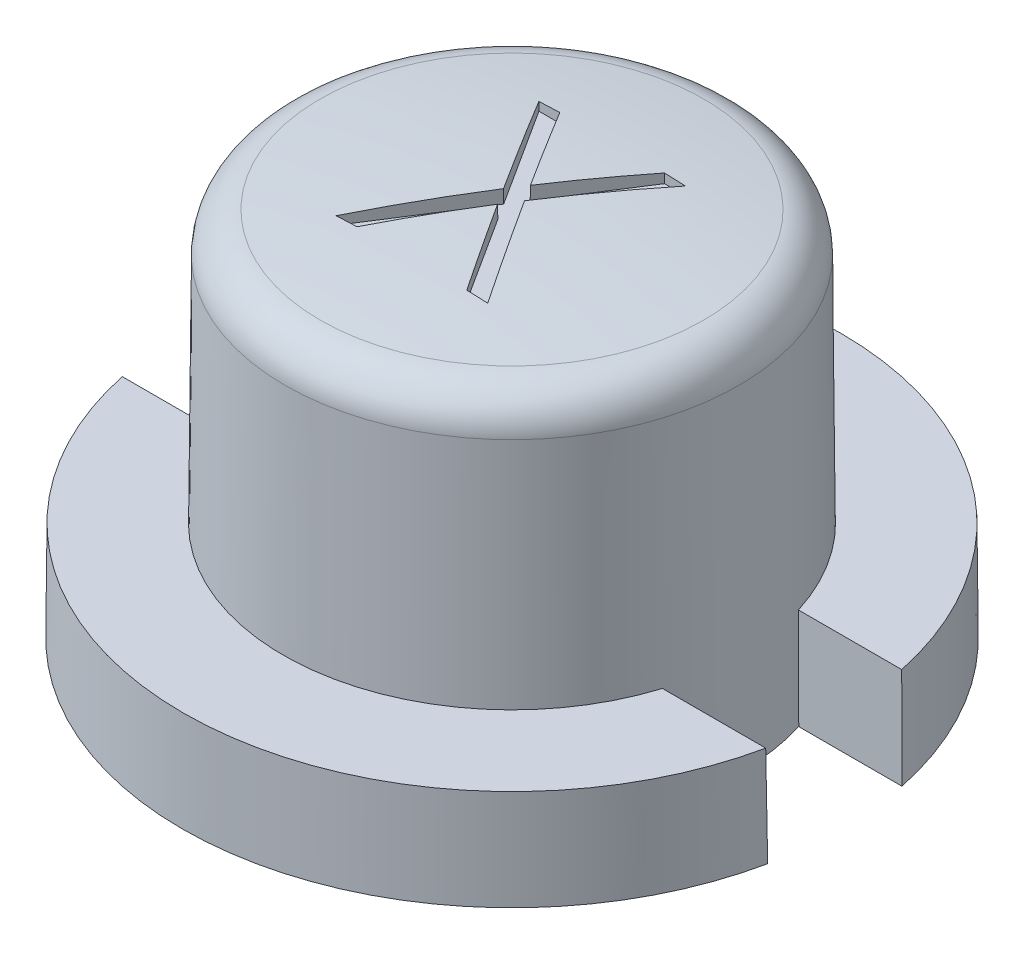
ISO-10303-21;
HEADER;
FILE_DESCRIPTION(('STEP AP214'),'2;1');
FILE_NAME('part.step','',(''),(''),'','','');
FILE_SCHEMA(('AUTOMOTIVE_DESIGN { 1 0 10303 214 1 1 1 1 }'));
ENDSEC;
DATA;
#1=APPLICATION_CONTEXT('core data for automotive mechanical design processes');
#2=APPLICATION_PROTOCOL_DEFINITION('international standard','automotive_design',2000,#1);
#3=PRODUCT_CONTEXT('',#1,'mechanical');
#4=PRODUCT('Part','Part','',(#3));
#5=PRODUCT_RELATED_PRODUCT_CATEGORY('part','',(#4));
#6=PRODUCT_DEFINITION_FORMATION('','',#4);
#7=PRODUCT_DEFINITION_CONTEXT('part definition',#1,'design');
#8=PRODUCT_DEFINITION('design','',#6,#7);
#9=PRODUCT_DEFINITION_SHAPE('','',#8);
#10=(LENGTH_UNIT() NAMED_UNIT(*) SI_UNIT(.MILLI.,.METRE.));
#11=(NAMED_UNIT(*) PLANE_ANGLE_UNIT() SI_UNIT($,.RADIAN.));
#12=(NAMED_UNIT(*) SI_UNIT($,.STERADIAN.) SOLID_ANGLE_UNIT());
#13=UNCERTAINTY_MEASURE_WITH_UNIT(LENGTH_MEASURE(1.E-05),#10,'distance_accuracy_value','');
#14=(GEOMETRIC_REPRESENTATION_CONTEXT(3) GLOBAL_UNCERTAINTY_ASSIGNED_CONTEXT((#13)) GLOBAL_UNIT_ASSIGNED_CONTEXT((#10,
#11,#12)) REPRESENTATION_CONTEXT('',''));
#15=CARTESIAN_POINT('',(0.,0.,0.));
#16=DIRECTION('',(0.,0.,1.));
#17=DIRECTION('',(1.,0.,0.));
#18=AXIS2_PLACEMENT_3D('',#15,#16,#17);
#19=CARTESIAN_POINT('',(0.,4.22622660203488,0.));
#20=DIRECTION('',(0.,-1.,0.));
#21=DIRECTION('',(1.,0.,0.));
#22=AXIS2_PLACEMENT_3D('',#19,#20,#21);
#23=CONICAL_SURFACE('',#22,3.4,0.00872664625996443);
#24=CARTESIAN_POINT('',(0.,0.75,0.));
#25=DIRECTION('',(0.,-1.,0.));
#26=DIRECTION('',(0.,0.,-1.));
#27=AXIS2_PLACEMENT_3D('',#24,#25,#26);
#28=CIRCLE('',#27,3.43033656996665);
#29=CARTESIAN_POINT('',(3.27529426574104,0.75,1.01963545252921));
#30=VERTEX_POINT('',#29);
#31=CARTESIAN_POINT('',(-3.27529426574104,0.75,1.01963545252921));
#32=VERTEX_POINT('',#31);
#33=EDGE_CURVE('E48',#30,#32,#28,.T.);
#34=ORIENTED_EDGE('',*,*,#33,.F.);
#35=CARTESIAN_POINT('',(3.26973350285921,1.21859774816533,1.02372484312449));
#36=CARTESIAN_POINT('',(3.27653711266679,0.64573232412735,1.01872552230702));
#37=CARTESIAN_POINT('',(3.28331987905421,0.0728666540791518,1.01372619934264));
#38=CARTESIAN_POINT('',(3.2968437249887,-1.07286517803107,1.00372754912015));
#39=CARTESIAN_POINT('',(3.30358480453575,-1.64573134009309,0.998728221862038));
#40=CARTESIAN_POINT('',(3.31030504066266,-2.21859774816533,0.993728892457024));
#41=B_SPLINE_CURVE_WITH_KNOTS('',3,(#35,#36,#37,#38,#39,#40),.UNSPECIFIED.,.F.,.F.,(4,2,4),(0.,
1.71878290532215,3.43756581062447),.UNSPECIFIED.);
#42=CARTESIAN_POINT('',(3.29303135116184,-0.75,1.00654515084307));
#43=VERTEX_POINT('',#42);
#44=EDGE_CURVE('E154',#30,#43,#41,.T.);
#45=ORIENTED_EDGE('',*,*,#44,.T.);
#46=CARTESIAN_POINT('',(0.,-0.75,0.));
#47=DIRECTION('',(0.,1.,0.));
#48=DIRECTION('',(0.,0.,1.));
#49=AXIS2_PLACEMENT_3D('',#46,#47,#48);
#50=CIRCLE('',#49,3.44342687165278);
#51=CARTESIAN_POINT('',(3.29303135116183,-0.75,-1.00654515084307));
#52=VERTEX_POINT('',#51);
#53=EDGE_CURVE('E294',#52,#43,#50,.F.);
#54=ORIENTED_EDGE('',*,*,#53,.F.);
#55=CARTESIAN_POINT('',(3.31030504066266,-2.21859774816533,-0.993728892457024));
#56=CARTESIAN_POINT('',(3.30358480453575,-1.64573134009309,-0.998728221862038));
#57=CARTESIAN_POINT('',(3.2968437249887,-1.07286517803107,-1.00372754912015));
#58=CARTESIAN_POINT('',(3.28331987905421,0.0728666540791515,-1.01372619934264));
#59=CARTESIAN_POINT('',(3.27653711266679,0.64573232412735,-1.01872552230702));
#60=CARTESIAN_POINT('',(3.26973350285921,1.21859774816533,-1.02372484312449));
#61=B_SPLINE_CURVE_WITH_KNOTS('',3,(#55,#56,#57,#58,#59,#60),.UNSPECIFIED.,.F.,.F.,(4,2,4),(0.,
1.71878290530232,3.43756581062447),.UNSPECIFIED.);
#62=CARTESIAN_POINT('',(3.27529426574104,0.75,-1.01963545252921));
#63=VERTEX_POINT('',#62);
#64=EDGE_CURVE('E385',#52,#63,#61,.T.);
#65=ORIENTED_EDGE('',*,*,#64,.T.);
#66=CARTESIAN_POINT('',(0.,0.75,0.));
#67=DIRECTION('',(0.,-1.,0.));
#68=DIRECTION('',(0.,0.,-1.));
#69=AXIS2_PLACEMENT_3D('',#66,#67,#68);
#70=CIRCLE('',#69,3.43033656996665);
#71=CARTESIAN_POINT('',(-3.27529426574104,0.75,-1.01963545252921));
#72=VERTEX_POINT('',#71);
#73=EDGE_CURVE('E12',#72,#63,#70,.T.);
#74=ORIENTED_EDGE('',*,*,#73,.F.);
#75=CARTESIAN_POINT('',(-3.26973350285921,1.21859774816533,-1.02372484312449));
#76=CARTESIAN_POINT('',(-3.27653711266679,0.64573232412735,-1.01872552230702));
#77=CARTESIAN_POINT('',(-3.28331987905421,0.0728666540791518,-1.01372619934264));
#78=CARTESIAN_POINT('',(-3.2968437249887,-1.07286517803107,-1.00372754912015));
#79=CARTESIAN_POINT('',(-3.30358480453575,-1.64573134009309,-0.998728221862038));
#80=CARTESIAN_POINT('',(-3.31030504066266,-2.21859774816533,-0.993728892457024));
#81=B_SPLINE_CURVE_WITH_KNOTS('',3,(#75,#76,#77,#78,#79,#80),.UNSPECIFIED.,.F.,.F.,(4,2,4),(0.,
1.71878290532215,3.43756581062447),.UNSPECIFIED.);
#82=CARTESIAN_POINT('',(-3.29303135116184,-0.75,-1.00654515084307));
#83=VERTEX_POINT('',#82);
#84=EDGE_CURVE('E302',#72,#83,#81,.T.);
#85=ORIENTED_EDGE('',*,*,#84,.T.);
#86=CARTESIAN_POINT('',(0.,-0.75,0.));
#87=DIRECTION('',(0.,1.,0.));
#88=DIRECTION('',(0.,0.,1.));
#89=AXIS2_PLACEMENT_3D('',#86,#87,#88);
#90=CIRCLE('',#89,3.44342687165278);
#91=CARTESIAN_POINT('',(-3.29303135116183,-0.75,1.00654515084307));
#92=VERTEX_POINT('',#91);
#93=EDGE_CURVE('E228',#92,#83,#90,.F.);
#94=ORIENTED_EDGE('',*,*,#93,.F.);
#95=CARTESIAN_POINT('',(-3.31030504066266,-2.21859774816533,0.993728892457024));
#96=CARTESIAN_POINT('',(-3.30358480453575,-1.64573134009309,0.998728221862038));
#97=CARTESIAN_POINT('',(-3.2968437249887,-1.07286517803107,1.00372754912015));
#98=CARTESIAN_POINT('',(-3.28331987905421,0.0728666540791515,1.01372619934264));
#99=CARTESIAN_POINT('',(-3.27653711266679,0.64573232412735,1.01872552230702));
#100=CARTESIAN_POINT('',(-3.26973350285921,1.21859774816533,1.02372484312449));
#101=B_SPLINE_CURVE_WITH_KNOTS('',3,(#95,#96,#97,#98,#99,#100),.UNSPECIFIED.,.F.,.F.,(4,2,4),
(0.,1.71878290530232,3.43756581062447),.UNSPECIFIED.);
#102=EDGE_CURVE('E336',#92,#32,#101,.T.);
#103=ORIENTED_EDGE('',*,*,#102,.T.);
#104=EDGE_LOOP('',(#34,#45,#54,#65,#74,#85,#94,#103));
#105=FACE_BOUND('',#104,.T.);
#106=CARTESIAN_POINT('',(0.,4.23669804630521,0.));
#107=DIRECTION('',(0.,-1.,0.));
#108=DIRECTION('',(1.,0.,0.));
#109=AXIS2_PLACEMENT_3D('',#106,#107,#108);
#110=CIRCLE('',#109,3.39990861709027);
#111=CARTESIAN_POINT('',(0.,4.23669804630521,3.39990861708849));
#112=VERTEX_POINT('',#111);
#113=EDGE_CURVE('E60',#112,#112,#110,.F.);
#114=ORIENTED_EDGE('',*,*,#113,.F.);
#115=EDGE_LOOP('',(#114));
#116=FACE_BOUND('',#115,.T.);
#117=ADVANCED_FACE('F44',(#105,#116),#23,.T.);
#118=CARTESIAN_POINT('',(0.,-0.75,0.));
#119=DIRECTION('',(0.,1.,0.));
#120=DIRECTION('',(1.,0.,0.));
#121=AXIS2_PLACEMENT_3D('',#118,#119,#120);
#122=PLANE('',#121);
#123=CARTESIAN_POINT('',(0.,-0.75,0.));
#124=DIRECTION('',(0.,1.,0.));
#125=DIRECTION('',(0.,0.,1.));
#126=AXIS2_PLACEMENT_3D('',#123,#124,#125);
#127=CIRCLE('',#126,2.08803389139633);
#128=CARTESIAN_POINT('',(0.,-0.75,2.08803389139633));
#129=VERTEX_POINT('',#128);
#130=EDGE_CURVE('E288',#129,#129,#127,.T.);
#131=ORIENTED_EDGE('',*,*,#130,.T.);
#132=EDGE_LOOP('',(#131));
#133=FACE_BOUND('',#132,.T.);
#134=ORIENTED_EDGE('',*,*,#93,.T.);
#135=DIRECTION('',(-1.,0.,0.));
#136=VECTOR('',#135,1.);
#137=CARTESIAN_POINT('',(-4.84790913936014,-0.75,-1.00654515084307));
#138=LINE('',#137,#136);
#139=CARTESIAN_POINT('',(-4.83986942950872,-0.75,-1.00654515084307));
#140=VERTEX_POINT('',#139);
#141=EDGE_CURVE('E308',#83,#140,#138,.T.);
#142=ORIENTED_EDGE('',*,*,#141,.T.);
#143=CARTESIAN_POINT('',(0.,-0.75,0.));
#144=DIRECTION('',(0.,1.,0.));
#145=DIRECTION('',(0.,0.,1.));
#146=AXIS2_PLACEMENT_3D('',#143,#144,#145);
#147=CIRCLE('',#146,4.94342687165277);
#148=CARTESIAN_POINT('',(4.83986942950872,-0.75,-1.00654515084307));
#149=VERTEX_POINT('',#148);
#150=EDGE_CURVE('E309',#140,#149,#147,.F.);
#151=ORIENTED_EDGE('',*,*,#150,.T.);
#152=DIRECTION('',(-1.,0.,0.));
#153=VECTOR('',#152,1.);
#154=CARTESIAN_POINT('',(-4.84790913936014,-0.75,-1.00654515084307));
#155=LINE('',#154,#153);
#156=EDGE_CURVE('E305',#149,#52,#155,.T.);
#157=ORIENTED_EDGE('',*,*,#156,.T.);
#158=ORIENTED_EDGE('',*,*,#53,.T.);
#159=DIRECTION('',(1.,0.,0.));
#160=VECTOR('',#159,1.);
#161=CARTESIAN_POINT('',(-4.84790913936014,-0.75,1.00654515084307));
#162=LINE('',#161,#160);
#163=CARTESIAN_POINT('',(4.83986942950872,-0.75,1.00654515084307));
#164=VERTEX_POINT('',#163);
#165=EDGE_CURVE('E298',#43,#164,#162,.T.);
#166=ORIENTED_EDGE('',*,*,#165,.T.);
#167=CARTESIAN_POINT('',(0.,-0.75,0.));
#168=DIRECTION('',(0.,1.,0.));
#169=DIRECTION('',(0.,0.,1.));
#170=AXIS2_PLACEMENT_3D('',#167,#168,#169);
#171=CIRCLE('',#170,4.94342687165277);
#172=CARTESIAN_POINT('',(-4.83986942950872,-0.75,1.00654515084307));
#173=VERTEX_POINT('',#172);
#174=EDGE_CURVE('E299',#164,#173,#171,.F.);
#175=ORIENTED_EDGE('',*,*,#174,.T.);
#176=DIRECTION('',(1.,0.,0.));
#177=VECTOR('',#176,1.);
#178=CARTESIAN_POINT('',(-4.84790913936014,-0.75,1.00654515084307));
#179=LINE('',#178,#177);
#180=EDGE_CURVE('E295',#173,#92,#179,.T.);
#181=ORIENTED_EDGE('',*,*,#180,.T.);
#182=EDGE_LOOP('',(#134,#142,#151,#157,#158,#166,#175,#181));
#183=FACE_BOUND('',#182,.T.);
#184=ADVANCED_FACE('F363',(#133,#183),#122,.F.);
#185=CARTESIAN_POINT('',(-4.84790913936014,-1.5,1.));
#186=DIRECTION('',(0.,0.00872653549837395,-0.999961923064171));
#187=DIRECTION('',(0.,0.999961923064171,0.00872653549837395));
#188=AXIS2_PLACEMENT_3D('',#185,#186,#187);
#189=PLANE('',#188);
#190=ORIENTED_EDGE('',*,*,#44,.F.);
#191=DIRECTION('',(1.,0.,0.));
#192=VECTOR('',#191,1.);
#193=CARTESIAN_POINT('',(0.,0.75,1.01963545252921));
#194=LINE('',#193,#192);
#195=CARTESIAN_POINT('',(4.82374981078994,0.75,1.01963545252921));
#196=VERTEX_POINT('',#195);
#197=EDGE_CURVE('E323',#30,#196,#194,.T.);
#198=ORIENTED_EDGE('',*,*,#197,.T.);
#199=CARTESIAN_POINT('',(4.78205311615585,4.60684322329632,1.0532936134286));
#200=CARTESIAN_POINT('',(4.7969165201097,3.23789621162842,1.04134699384522));
#201=CARTESIAN_POINT('',(4.8117121989267,1.86894847052964,1.02940036789619));
#202=CARTESIAN_POINT('',(4.83361254327773,-0.166666493674199,1.01163582523069));
#203=CARTESIAN_POINT('',(4.84076887219549,-0.833333160340866,1.00581791337019));
#204=CARTESIAN_POINT('',(4.84790913936014,-1.5,1.));
#205=B_SPLINE_CURVE_WITH_KNOTS('',3,(#199,#200,#201,#202,#203,#204),.UNSPECIFIED.,.F.,.F.,(4,2,
4),(0.,4.10723945814995,6.10743083656302),.UNSPECIFIED.);
#206=EDGE_CURVE('E331',#196,#164,#205,.T.);
#207=ORIENTED_EDGE('',*,*,#206,.T.);
#208=ORIENTED_EDGE('',*,*,#165,.F.);
#209=EDGE_LOOP('',(#190,#198,#207,#208));
#210=FACE_BOUND('',#209,.T.);
#211=ADVANCED_FACE('F358',(#210),#189,.T.);
#212=ORIENTED_EDGE('',*,*,#102,.F.);
#213=ORIENTED_EDGE('',*,*,#180,.F.);
#214=CARTESIAN_POINT('',(-4.78205311615585,4.60684322329632,1.0532936134286));
#215=CARTESIAN_POINT('',(-4.7969165201097,3.23789621162842,1.04134699384522));
#216=CARTESIAN_POINT('',(-4.8117121989267,1.86894847052964,1.02940036789619));
#217=CARTESIAN_POINT('',(-4.83361254327773,-0.166666493674199,1.01163582523069));
#218=CARTESIAN_POINT('',(-4.84076887219549,-0.833333160340866,1.00581791337019));
#219=CARTESIAN_POINT('',(-4.84790913936014,-1.5,1.));
#220=B_SPLINE_CURVE_WITH_KNOTS('',3,(#214,#215,#216,#217,#218,#219),.UNSPECIFIED.,.F.,.F.,(4,2,
4),(0.,4.10723945814995,6.10743083656302),.UNSPECIFIED.);
#221=CARTESIAN_POINT('',(-4.82374981078994,0.75,1.01963545252921));
#222=VERTEX_POINT('',#221);
#223=EDGE_CURVE('E327',#222,#173,#220,.T.);
#224=ORIENTED_EDGE('',*,*,#223,.F.);
#225=DIRECTION('',(1.,0.,0.));
#226=VECTOR('',#225,1.);
#227=CARTESIAN_POINT('',(0.,0.75,1.01963545252921));
#228=LINE('',#227,#226);
#229=EDGE_CURVE('E325',#222,#32,#228,.T.);
#230=ORIENTED_EDGE('',*,*,#229,.T.);
#231=EDGE_LOOP('',(#212,#213,#224,#230));
#232=FACE_BOUND('',#231,.T.);
#233=ADVANCED_FACE('F362',(#232),#189,.T.);
#234=CARTESIAN_POINT('',(0.,-1.5,0.));
#235=DIRECTION('',(0.,-1.,0.));
#236=DIRECTION('',(0.,0.,-1.));
#237=AXIS2_PLACEMENT_3D('',#234,#235,#236);
#238=CONICAL_SURFACE('',#237,4.94997202249584,0.00872664625997167);
#239=ORIENTED_EDGE('',*,*,#174,.F.);
#240=ORIENTED_EDGE('',*,*,#206,.F.);
#241=CARTESIAN_POINT('',(0.,0.75,0.));
#242=DIRECTION('',(0.,-1.,0.));
#243=DIRECTION('',(0.,0.,-1.));
#244=AXIS2_PLACEMENT_3D('',#241,#242,#243);
#245=CIRCLE('',#244,4.93033656996664);
#246=EDGE_CURVE('E297',#196,#222,#245,.T.);
#247=ORIENTED_EDGE('',*,*,#246,.T.);
#248=ORIENTED_EDGE('',*,*,#223,.T.);
#249=EDGE_LOOP('',(#239,#240,#247,#248));
#250=FACE_BOUND('',#249,.T.);
#251=ADVANCED_FACE('F356',(#250),#238,.T.);
#252=CARTESIAN_POINT('',(0.,0.75,0.));
#253=DIRECTION('',(0.,-1.,0.));
#254=DIRECTION('',(0.,0.,-1.));
#255=AXIS2_PLACEMENT_3D('',#252,#253,#254);
#256=PLANE('',#255);
#257=ORIENTED_EDGE('',*,*,#197,.F.);
#258=ORIENTED_EDGE('',*,*,#33,.T.);
#259=ORIENTED_EDGE('',*,*,#229,.F.);
#260=ORIENTED_EDGE('',*,*,#246,.F.);
#261=EDGE_LOOP('',(#257,#258,#259,#260));
#262=FACE_BOUND('',#261,.T.);
#263=ADVANCED_FACE('F46',(#262),#256,.F.);
#264=CARTESIAN_POINT('',(-4.84790913936014,-1.5,-1.));
#265=DIRECTION('',(0.,0.00872653549837395,0.999961923064171));
#266=DIRECTION('',(0.,-0.999961923064171,0.00872653549837395));
#267=AXIS2_PLACEMENT_3D('',#264,#265,#266);
#268=PLANE('',#267);
#269=ORIENTED_EDGE('',*,*,#84,.F.);
#270=DIRECTION('',(-1.,0.,0.));
#271=VECTOR('',#270,1.);
#272=CARTESIAN_POINT('',(0.,0.75,-1.01963545252921));
#273=LINE('',#272,#271);
#274=CARTESIAN_POINT('',(-4.82374981078994,0.75,-1.01963545252921));
#275=VERTEX_POINT('',#274);
#276=EDGE_CURVE('E315',#72,#275,#273,.T.);
#277=ORIENTED_EDGE('',*,*,#276,.T.);
#278=CARTESIAN_POINT('',(-4.78205311615585,4.60684322329632,-1.0532936134286));
#279=CARTESIAN_POINT('',(-4.7969165201097,3.23789621162842,-1.04134699384522));
#280=CARTESIAN_POINT('',(-4.8117121989267,1.86894847052964,-1.02940036789619));
#281=CARTESIAN_POINT('',(-4.83361254327773,-0.166666493674199,-1.01163582523069));
#282=CARTESIAN_POINT('',(-4.84076887219549,-0.833333160340866,-1.00581791337019));
#283=CARTESIAN_POINT('',(-4.84790913936014,-1.5,-1.));
#284=B_SPLINE_CURVE_WITH_KNOTS('',3,(#278,#279,#280,#281,#282,#283),.UNSPECIFIED.,.F.,.F.,(4,2,
4),(0.,4.10723945814995,6.10743083656302),.UNSPECIFIED.);
#285=EDGE_CURVE('E392',#275,#140,#284,.T.);
#286=ORIENTED_EDGE('',*,*,#285,.T.);
#287=ORIENTED_EDGE('',*,*,#141,.F.);
#288=EDGE_LOOP('',(#269,#277,#286,#287));
#289=FACE_BOUND('',#288,.T.);
#290=ADVANCED_FACE('F402',(#289),#268,.T.);
#291=ORIENTED_EDGE('',*,*,#64,.F.);
#292=ORIENTED_EDGE('',*,*,#156,.F.);
#293=CARTESIAN_POINT('',(4.78205311615585,4.60684322329632,-1.0532936134286));
#294=CARTESIAN_POINT('',(4.7969165201097,3.23789621162842,-1.04134699384522));
#295=CARTESIAN_POINT('',(4.8117121989267,1.86894847052964,-1.02940036789619));
#296=CARTESIAN_POINT('',(4.83361254327773,-0.166666493674199,-1.01163582523069));
#297=CARTESIAN_POINT('',(4.84076887219549,-0.833333160340866,-1.00581791337019));
#298=CARTESIAN_POINT('',(4.84790913936014,-1.5,-1.));
#299=B_SPLINE_CURVE_WITH_KNOTS('',3,(#293,#294,#295,#296,#297,#298),.UNSPECIFIED.,.F.,.F.,(4,2,
4),(0.,4.10723945814995,6.10743083656302),.UNSPECIFIED.);
#300=CARTESIAN_POINT('',(4.82374981078994,0.75,-1.01963545252921));
#301=VERTEX_POINT('',#300);
#302=EDGE_CURVE('E321',#301,#149,#299,.T.);
#303=ORIENTED_EDGE('',*,*,#302,.F.);
#304=DIRECTION('',(-1.,0.,0.));
#305=VECTOR('',#304,1.);
#306=CARTESIAN_POINT('',(0.,0.75,-1.01963545252921));
#307=LINE('',#306,#305);
#308=EDGE_CURVE('E317',#301,#63,#307,.T.);
#309=ORIENTED_EDGE('',*,*,#308,.T.);
#310=EDGE_LOOP('',(#291,#292,#303,#309));
#311=FACE_BOUND('',#310,.T.);
#312=ADVANCED_FACE('F406',(#311),#268,.T.);
#313=CARTESIAN_POINT('',(0.,-1.5,0.));
#314=DIRECTION('',(0.,-1.,0.));
#315=DIRECTION('',(0.,0.,-1.));
#316=AXIS2_PLACEMENT_3D('',#313,#314,#315);
#317=CONICAL_SURFACE('',#316,4.94997202249584,0.00872664625997167);
#318=ORIENTED_EDGE('',*,*,#150,.F.);
#319=ORIENTED_EDGE('',*,*,#285,.F.);
#320=CARTESIAN_POINT('',(0.,0.75,0.));
#321=DIRECTION('',(0.,-1.,0.));
#322=DIRECTION('',(0.,0.,-1.));
#323=AXIS2_PLACEMENT_3D('',#320,#321,#322);
#324=CIRCLE('',#323,4.93033656996664);
#325=EDGE_CURVE('E307',#275,#301,#324,.T.);
#326=ORIENTED_EDGE('',*,*,#325,.T.);
#327=ORIENTED_EDGE('',*,*,#302,.T.);
#328=EDGE_LOOP('',(#318,#319,#326,#327));
#329=FACE_BOUND('',#328,.T.);
#330=ADVANCED_FACE('F364',(#329),#317,.T.);
#331=CARTESIAN_POINT('',(0.,0.75,0.));
#332=DIRECTION('',(0.,-1.,0.));
#333=DIRECTION('',(0.,0.,-1.));
#334=AXIS2_PLACEMENT_3D('',#331,#332,#333);
#335=PLANE('',#334);
#336=ORIENTED_EDGE('',*,*,#276,.F.);
#337=ORIENTED_EDGE('',*,*,#73,.T.);
#338=ORIENTED_EDGE('',*,*,#308,.F.);
#339=ORIENTED_EDGE('',*,*,#325,.F.);
#340=EDGE_LOOP('',(#336,#337,#338,#339));
#341=FACE_BOUND('',#340,.T.);
#342=ADVANCED_FACE('F479',(#341),#335,.F.);
#343=CARTESIAN_POINT('',(0.,4.8,0.));
#344=DIRECTION('',(0.,-1.,0.));
#345=DIRECTION('',(0.,0.,-1.));
#346=AXIS2_PLACEMENT_3D('',#343,#344,#345);
#347=PLANE('',#346);
#348=DIRECTION('',(0.539190475611024,0.,0.842183846324754));
#349=VECTOR('',#348,1.);
#350=CARTESIAN_POINT('',(-0.155048076923077,4.8,-0.030048076923077));
#351=LINE('',#350,#349);
#352=CARTESIAN_POINT('',(-1.09615384615385,4.8,-1.5));
#353=VERTEX_POINT('',#352);
#354=CARTESIAN_POINT('',(-0.155048076923077,4.8,-0.030048076923077));
#355=VERTEX_POINT('',#354);
#356=EDGE_CURVE('E195',#353,#355,#351,.T.);
#357=ORIENTED_EDGE('',*,*,#356,.T.);
#358=DIRECTION('',(-0.539185104098949,0.,0.842187285298113));
#359=VECTOR('',#358,1.);
#360=CARTESIAN_POINT('',(-1.13461538461539,4.8,1.5));
#361=LINE('',#360,#359);
#362=CARTESIAN_POINT('',(-1.13461538461539,4.8,1.5));
#363=VERTEX_POINT('',#362);
#364=EDGE_CURVE('E241',#355,#363,#361,.T.);
#365=ORIENTED_EDGE('',*,*,#364,.T.);
#366=DIRECTION('',(1.,0.,0.));
#367=VECTOR('',#366,1.);
#368=CARTESIAN_POINT('',(-0.82391826923077,4.8,1.5));
#369=LINE('',#368,#367);
#370=CARTESIAN_POINT('',(-0.82391826923077,4.8,1.5));
#371=VERTEX_POINT('',#370);
#372=EDGE_CURVE('E234',#363,#371,#369,.T.);
#373=ORIENTED_EDGE('',*,*,#372,.T.);
#374=DIRECTION('',(0.539087169942497,0.,-0.842249976671647));
#375=VECTOR('',#374,1.);
#376=CARTESIAN_POINT('',(0.,4.8,0.212740384615385));
#377=LINE('',#376,#375);
#378=CARTESIAN_POINT('',(0.,4.8,0.212740384615385));
#379=VERTEX_POINT('',#378);
#380=EDGE_CURVE('E229',#371,#379,#377,.T.);
#381=ORIENTED_EDGE('',*,*,#380,.T.);
#382=DIRECTION('',(0.539087169942497,0.,0.842249976671647));
#383=VECTOR('',#382,1.);
#384=CARTESIAN_POINT('',(0.823918269230769,4.8,1.5));
#385=LINE('',#384,#383);
#386=CARTESIAN_POINT('',(0.823918269230769,4.8,1.5));
#387=VERTEX_POINT('',#386);
#388=EDGE_CURVE('E245',#379,#387,#385,.T.);
#389=ORIENTED_EDGE('',*,*,#388,.T.);
#390=DIRECTION('',(1.,0.,0.));
#391=VECTOR('',#390,1.);
#392=CARTESIAN_POINT('',(1.13461538461538,4.8,1.5));
#393=LINE('',#392,#391);
#394=CARTESIAN_POINT('',(1.13461538461538,4.8,1.5));
#395=VERTEX_POINT('',#394);
#396=EDGE_CURVE('E218',#387,#395,#393,.T.);
#397=ORIENTED_EDGE('',*,*,#396,.T.);
#398=DIRECTION('',(-0.538950419912938,0.,-0.842337488703707));
#399=VECTOR('',#398,1.);
#400=CARTESIAN_POINT('',(0.155649038461538,4.8,-0.030048076923077));
#401=LINE('',#400,#399);
#402=CARTESIAN_POINT('',(0.155649038461538,4.8,-0.030048076923077));
#403=VERTEX_POINT('',#402);
#404=EDGE_CURVE('E248',#395,#403,#401,.T.);
#405=ORIENTED_EDGE('',*,*,#404,.T.);
#406=DIRECTION('',(0.538946197134426,0.,-0.842340190537256));
#407=VECTOR('',#406,1.);
#408=CARTESIAN_POINT('',(1.09615384615385,4.8,-1.5));
#409=LINE('',#408,#407);
#410=CARTESIAN_POINT('',(1.09615384615385,4.8,-1.5));
#411=VERTEX_POINT('',#410);
#412=EDGE_CURVE('E251',#403,#411,#409,.T.);
#413=ORIENTED_EDGE('',*,*,#412,.T.);
#414=DIRECTION('',(-1.,0.,0.));
#415=VECTOR('',#414,1.);
#416=CARTESIAN_POINT('',(0.785456730769231,4.8,-1.5));
#417=LINE('',#416,#415);
#418=CARTESIAN_POINT('',(0.785456730769231,4.8,-1.5));
#419=VERTEX_POINT('',#418);
#420=EDGE_CURVE('E223',#411,#419,#417,.T.);
#421=ORIENTED_EDGE('',*,*,#420,.T.);
#422=DIRECTION('',(-0.539088809128561,0.,0.842248927498486));
#423=VECTOR('',#422,1.);
#424=CARTESIAN_POINT('',(0.,4.8,-0.272836538461538));
#425=LINE('',#424,#423);
#426=CARTESIAN_POINT('',(0.,4.8,-0.272836538461538));
#427=VERTEX_POINT('',#426);
#428=EDGE_CURVE('E238',#419,#427,#425,.T.);
#429=ORIENTED_EDGE('',*,*,#428,.T.);
#430=DIRECTION('',(-0.539088809128561,0.,-0.842248927498486));
#431=VECTOR('',#430,1.);
#432=CARTESIAN_POINT('',(-0.785456730769231,4.8,-1.5));
#433=LINE('',#432,#431);
#434=CARTESIAN_POINT('',(-0.785456730769231,4.8,-1.5));
#435=VERTEX_POINT('',#434);
#436=EDGE_CURVE('E185',#427,#435,#433,.T.);
#437=ORIENTED_EDGE('',*,*,#436,.T.);
#438=DIRECTION('',(-1.,0.,0.));
#439=VECTOR('',#438,1.);
#440=CARTESIAN_POINT('',(-1.09615384615385,4.8,-1.5));
#441=LINE('',#440,#439);
#442=EDGE_CURVE('E190',#435,#353,#441,.T.);
#443=ORIENTED_EDGE('',*,*,#442,.T.);
#444=EDGE_LOOP('',(#357,#365,#373,#381,#389,#397,#405,#413,#421,#429,#437,#443));
#445=FACE_BOUND('',#444,.T.);
#446=ADVANCED_FACE('F192',(#445),#347,.F.);
#447=CARTESIAN_POINT('',(0.823918269230769,4.8,1.5));
#448=DIRECTION('',(0.842217906373333,0.00872653549837395,-0.539066643154921));
#449=DIRECTION('',(-0.539087169942497,0.,-0.842249976671647));
#450=AXIS2_PLACEMENT_3D('',#447,#448,#449);
#451=PLANE('',#450);
#452=CARTESIAN_POINT('',(0.0727859584566516,-18.244245837395,-0.0465870910569885));
#453=DIRECTION('',(0.842217906373333,0.00872653549837395,-0.539066643154921));
#454=DIRECTION('',(-0.539087169942497,0.,-0.842249976671647));
#455=AXIS2_PLACEMENT_3D('',#452,#453,#454);
#456=CIRCLE('',#455,23.244839347228);
#457=CARTESIAN_POINT('',(0.,4.99899676271613,0.215961790235552));
#458=VERTEX_POINT('',#457);
#459=CARTESIAN_POINT('',(0.823264663810743,4.93686092110198,1.50119436716418));
#460=VERTEX_POINT('',#459);
#461=EDGE_CURVE('E212',#458,#460,#456,.T.);
#462=ORIENTED_EDGE('',*,*,#461,.T.);
#463=DIRECTION('',(-0.00477545434437354,0.999950520951239,0.00872643599364186));
#464=VECTOR('',#463,1.);
#465=CARTESIAN_POINT('',(0.823918269230769,4.8,1.5));
#466=LINE('',#465,#464);
#467=EDGE_CURVE('E221',#387,#460,#466,.T.);
#468=ORIENTED_EDGE('',*,*,#467,.F.);
#469=ORIENTED_EDGE('',*,*,#388,.F.);
#470=DIRECTION('',(0.,0.999868996331342,0.0161861105690812));
#471=VECTOR('',#470,1.);
#472=CARTESIAN_POINT('',(0.,4.82083299690912,0.213077633987746));
#473=LINE('',#472,#471);
#474=EDGE_CURVE('E233',#379,#458,#473,.T.);
#475=ORIENTED_EDGE('',*,*,#474,.T.);
#476=EDGE_LOOP('',(#462,#468,#469,#475));
#477=FACE_BOUND('',#476,.T.);
#478=ADVANCED_FACE('F441',(#477),#451,.T.);
#479=CARTESIAN_POINT('',(1.13461538461538,4.8,1.5));
#480=DIRECTION('',(0.,0.00872653549837395,-0.999961923064171));
#481=DIRECTION('',(0.,0.999961923064171,0.00872653549837395));
#482=AXIS2_PLACEMENT_3D('',#479,#480,#481);
#483=PLANE('',#482);
#484=CARTESIAN_POINT('',(0.,-18.2563343722675,1.29879041819369));
#485=DIRECTION('',(0.,0.00872653549837395,-0.999961923064171));
#486=DIRECTION('',(0.,0.999961923064171,0.00872653549837395));
#487=AXIS2_PLACEMENT_3D('',#484,#485,#486);
#488=CIRCLE('',#487,23.2086845810273);
#489=CARTESIAN_POINT('',(1.13658638221551,4.92362013116651,1.50107881654097));
#490=VERTEX_POINT('',#489);
#491=EDGE_CURVE('E278',#460,#490,#488,.T.);
#492=ORIENTED_EDGE('',*,*,#491,.T.);
#493=DIRECTION('',(0.0159413526261571,0.999834856467312,0.00872542660498254));
#494=VECTOR('',#493,1.);
#495=CARTESIAN_POINT('',(1.13461538461538,4.8,1.5));
#496=LINE('',#495,#494);
#497=EDGE_CURVE('E222',#395,#490,#496,.T.);
#498=ORIENTED_EDGE('',*,*,#497,.F.);
#499=ORIENTED_EDGE('',*,*,#396,.F.);
#500=ORIENTED_EDGE('',*,*,#467,.T.);
#501=EDGE_LOOP('',(#492,#498,#499,#500));
#502=FACE_BOUND('',#501,.T.);
#503=ADVANCED_FACE('F444',(#502),#483,.T.);
#504=CARTESIAN_POINT('',(0.155649038461538,4.8,-0.030048076923077));
#505=DIRECTION('',(-0.842305415073203,0.00872653549837395,0.538929898332384));
#506=DIRECTION('',(0.538950419912938,0.,0.842337488703707));
#507=AXIS2_PLACEMENT_3D('',#504,#505,#506);
#508=PLANE('',#507);
#509=CARTESIAN_POINT('',(-0.0453203907430069,-18.2445304672254,0.0289972178006121));
#510=DIRECTION('',(-0.842305415073203,0.00872653549837395,0.538929898332384));
#511=DIRECTION('',(0.538950419912938,0.,0.842337488703707));
#512=AXIS2_PLACEMENT_3D('',#509,#510,#511);
#513=CIRCLE('',#512,23.2449377285267);
#514=CARTESIAN_POINT('',(0.157715350362243,4.99944552965335,-0.0300480821024489));
#515=VERTEX_POINT('',#514);
#516=EDGE_CURVE('E275',#490,#515,#513,.T.);
#517=ORIENTED_EDGE('',*,*,#516,.T.);
#518=DIRECTION('',(0.0103597258809036,0.999946336599956,-2.59674763820624E-08));
#519=VECTOR('',#518,1.);
#520=CARTESIAN_POINT('',(0.155749977520029,4.80974288730379,-0.0300480771760856));
#521=LINE('',#520,#519);
#522=EDGE_CURVE('E249',#403,#515,#521,.T.);
#523=ORIENTED_EDGE('',*,*,#522,.F.);
#524=ORIENTED_EDGE('',*,*,#404,.F.);
#525=ORIENTED_EDGE('',*,*,#497,.T.);
#526=EDGE_LOOP('',(#517,#523,#524,#525));
#527=FACE_BOUND('',#526,.T.);
#528=ADVANCED_FACE('F448',(#527),#508,.T.);
#529=CARTESIAN_POINT('',(1.09615384615385,4.8,-1.5));
#530=DIRECTION('',(-0.842308116803875,0.00872653549837395,-0.538925675714663));
#531=DIRECTION('',(-0.538946197134426,0.,0.842340190537256));
#532=AXIS2_PLACEMENT_3D('',#529,#530,#531);
#533=PLANE('',#532);
#534=CARTESIAN_POINT('',(-0.072600425253415,-18.2442478403383,-0.0464512123964));
#535=DIRECTION('',(-0.842308116803875,0.00872653549837395,-0.538925675714663));
#536=DIRECTION('',(-0.538946197134426,0.,0.842340190537256));
#537=AXIS2_PLACEMENT_3D('',#534,#535,#536);
#538=CIRCLE('',#537,23.2448401994373);
#539=CARTESIAN_POINT('',(1.09815436597988,4.92547249936336,-1.50109498191332));
#540=VERTEX_POINT('',#539);
#541=EDGE_CURVE('E272',#515,#540,#538,.T.);
#542=ORIENTED_EDGE('',*,*,#541,.T.);
#543=DIRECTION('',(0.0159412577759796,0.999834857979482,-0.00872542661817905));
#544=VECTOR('',#543,1.);
#545=CARTESIAN_POINT('',(1.09615384615385,4.8,-1.5));
#546=LINE('',#545,#544);
#547=EDGE_CURVE('E225',#411,#540,#546,.T.);
#548=ORIENTED_EDGE('',*,*,#547,.F.);
#549=ORIENTED_EDGE('',*,*,#412,.F.);
#550=ORIENTED_EDGE('',*,*,#522,.T.);
#551=EDGE_LOOP('',(#542,#548,#549,#550));
#552=FACE_BOUND('',#551,.T.);
#553=ADVANCED_FACE('F452',(#552),#533,.T.);
#554=CARTESIAN_POINT('',(0.785456730769231,4.8,-1.5));
#555=DIRECTION('',(0.,0.00872653549837395,0.999961923064171));
#556=DIRECTION('',(0.,-0.999961923064171,0.00872653549837395));
#557=AXIS2_PLACEMENT_3D('',#554,#555,#556);
#558=PLANE('',#557);
#559=CARTESIAN_POINT('',(0.,-18.2563343722675,-1.29879041819369));
#560=DIRECTION('',(0.,0.00872653549837395,0.999961923064171));
#561=DIRECTION('',(0.,-0.999961923064171,0.00872653549837395));
#562=AXIS2_PLACEMENT_3D('',#559,#560,#561);
#563=CIRCLE('',#562,23.2086845810273);
#564=CARTESIAN_POINT('',(0.784796758901188,4.93819433515788,-1.50120600369235));
#565=VERTEX_POINT('',#564);
#566=EDGE_CURVE('E269',#540,#565,#563,.T.);
#567=ORIENTED_EDGE('',*,*,#566,.T.);
#568=DIRECTION('',(-0.0047754433099139,0.999950521003932,-0.0087264359941017));
#569=VECTOR('',#568,1.);
#570=CARTESIAN_POINT('',(0.785456730769231,4.8,-1.5));
#571=LINE('',#570,#569);
#572=EDGE_CURVE('E226',#419,#565,#571,.T.);
#573=ORIENTED_EDGE('',*,*,#572,.F.);
#574=ORIENTED_EDGE('',*,*,#420,.F.);
#575=ORIENTED_EDGE('',*,*,#547,.T.);
#576=EDGE_LOOP('',(#567,#573,#574,#575));
#577=FACE_BOUND('',#576,.T.);
#578=ADVANCED_FACE('F456',(#577),#558,.T.);
#579=CARTESIAN_POINT('',(0.,4.8,-0.272836538461538));
#580=DIRECTION('',(0.842216857240122,0.00872653549837395,0.53906828227857));
#581=DIRECTION('',(0.539088809128561,0.,-0.842248927498486));
#582=AXIS2_PLACEMENT_3D('',#579,#580,#581);
#583=PLANE('',#582);
#584=CARTESIAN_POINT('',(0.0455011753908782,-18.2445285446749,0.0291234261684025));
#585=DIRECTION('',(0.842216857240122,0.00872653549837395,0.53906828227857));
#586=DIRECTION('',(0.539088809128561,0.,-0.842248927498486));
#587=AXIS2_PLACEMENT_3D('',#584,#585,#586);
#588=CIRCLE('',#587,23.2449372175279);
#589=CARTESIAN_POINT('',(0.,4.9983608305816,-0.276047639701331));
#590=VERTEX_POINT('',#589);
#591=EDGE_CURVE('E266',#565,#590,#588,.T.);
#592=ORIENTED_EDGE('',*,*,#591,.T.);
#593=DIRECTION('',(0.,0.99986899712786,-0.0161860613655078));
#594=VECTOR('',#593,1.);
#595=CARTESIAN_POINT('',(0.,4.81986034099137,-0.273158041277358));
#596=LINE('',#595,#594);
#597=EDGE_CURVE('E240',#427,#590,#596,.T.);
#598=ORIENTED_EDGE('',*,*,#597,.F.);
#599=ORIENTED_EDGE('',*,*,#428,.F.);
#600=ORIENTED_EDGE('',*,*,#572,.T.);
#601=EDGE_LOOP('',(#592,#598,#599,#600));
#602=FACE_BOUND('',#601,.T.);
#603=ADVANCED_FACE('F460',(#602),#583,.T.);
#604=CARTESIAN_POINT('',(-0.785456730769231,4.8,-1.5));
#605=DIRECTION('',(-0.842216857240122,0.00872653549837395,0.53906828227857));
#606=DIRECTION('',(0.539088809128561,0.,0.842248927498486));
#607=AXIS2_PLACEMENT_3D('',#604,#605,#606);
#608=PLANE('',#607);
#609=CARTESIAN_POINT('',(-0.0455011753908782,-18.2445285446749,0.0291234261684025));
#610=DIRECTION('',(-0.842216857240122,0.00872653549837395,0.53906828227857));
#611=DIRECTION('',(0.539088809128561,0.,0.842248927498486));
#612=AXIS2_PLACEMENT_3D('',#609,#610,#611);
#613=CIRCLE('',#612,23.2449372175279);
#614=CARTESIAN_POINT('',(-0.784796758901188,4.93819433515788,-1.50120600369235));
#615=VERTEX_POINT('',#614);
#616=EDGE_CURVE('E263',#590,#615,#613,.T.);
#617=ORIENTED_EDGE('',*,*,#616,.T.);
#618=DIRECTION('',(0.0047754433099139,0.999950521003932,-0.0087264359941017));
#619=VECTOR('',#618,1.);
#620=CARTESIAN_POINT('',(-0.785456730769231,4.8,-1.5));
#621=LINE('',#620,#619);
#622=EDGE_CURVE('E198',#435,#615,#621,.T.);
#623=ORIENTED_EDGE('',*,*,#622,.F.);
#624=ORIENTED_EDGE('',*,*,#436,.F.);
#625=ORIENTED_EDGE('',*,*,#597,.T.);
#626=EDGE_LOOP('',(#617,#623,#624,#625));
#627=FACE_BOUND('',#626,.T.);
#628=ADVANCED_FACE('F464',(#627),#608,.T.);
#629=CARTESIAN_POINT('',(-1.09615384615385,4.8,-1.5));
#630=DIRECTION('',(0.,0.00872653549837395,0.999961923064171));
#631=DIRECTION('',(0.,-0.999961923064171,0.00872653549837395));
#632=AXIS2_PLACEMENT_3D('',#629,#630,#631);
#633=PLANE('',#632);
#634=CARTESIAN_POINT('',(0.,-18.2563343722675,-1.29879041819369));
#635=DIRECTION('',(0.,0.00872653549837395,0.999961923064171));
#636=DIRECTION('',(0.,-0.999961923064171,0.00872653549837395));
#637=AXIS2_PLACEMENT_3D('',#634,#635,#636);
#638=CIRCLE('',#637,23.2086845810273);
#639=CARTESIAN_POINT('',(-1.09815505444259,4.9254724667524,-1.50109498162873));
#640=VERTEX_POINT('',#639);
#641=EDGE_CURVE('E204',#615,#640,#638,.T.);
#642=ORIENTED_EDGE('',*,*,#641,.T.);
#643=DIRECTION('',(-0.0159467465795492,0.999834770458193,-0.00872542585439233));
#644=VECTOR('',#643,1.);
#645=CARTESIAN_POINT('',(-1.09615384615385,4.8,-1.5));
#646=LINE('',#645,#644);
#647=EDGE_CURVE('E199',#353,#640,#646,.T.);
#648=ORIENTED_EDGE('',*,*,#647,.F.);
#649=ORIENTED_EDGE('',*,*,#442,.F.);
#650=ORIENTED_EDGE('',*,*,#622,.T.);
#651=EDGE_LOOP('',(#642,#648,#649,#650));
#652=FACE_BOUND('',#651,.T.);
#653=ADVANCED_FACE('F202',(#652),#633,.T.);
#654=CARTESIAN_POINT('',(-0.155048076923077,4.8,-0.030048076923077));
#655=DIRECTION('',(0.842151778544482,0.00872653549837395,-0.539169944889885));
#656=DIRECTION('',(-0.539190475611024,0.,-0.842183846324754));
#657=AXIS2_PLACEMENT_3D('',#654,#655,#656);
#658=PLANE('',#657);
#659=CARTESIAN_POINT('',(0.0730398378996447,-18.2442431474296,-0.0467622183772869));
#660=DIRECTION('',(0.842151778544482,0.00872653549837395,-0.539169944889885));
#661=DIRECTION('',(-0.539190475611024,0.,-0.842183846324754));
#662=AXIS2_PLACEMENT_3D('',#659,#660,#661);
#663=CIRCLE('',#662,23.2448381991397);
#664=CARTESIAN_POINT('',(-0.157114807025643,4.99944959664312,-0.0300480703322143));
#665=VERTEX_POINT('',#664);
#666=EDGE_CURVE('E259',#640,#665,#663,.T.);
#667=ORIENTED_EDGE('',*,*,#666,.T.);
#668=DIRECTION('',(-0.0103616110998073,0.999946317066779,3.30435009833111E-08));
#669=VECTOR('',#668,1.);
#670=CARTESIAN_POINT('',(-0.155153246716698,4.81014940116766,-0.0300480765876915));
#671=LINE('',#670,#669);
#672=EDGE_CURVE('E210',#355,#665,#671,.T.);
#673=ORIENTED_EDGE('',*,*,#672,.F.);
#674=ORIENTED_EDGE('',*,*,#356,.F.);
#675=ORIENTED_EDGE('',*,*,#647,.T.);
#676=EDGE_LOOP('',(#667,#673,#674,#675));
#677=FACE_BOUND('',#676,.T.);
#678=ADVANCED_FACE('F209',(#677),#658,.T.);
#679=CARTESIAN_POINT('',(-1.13461538461539,4.8,1.5));
#680=DIRECTION('',(0.842155217386895,0.00872653549837395,0.53916457358234));
#681=DIRECTION('',(0.539185104098949,0.,-0.842187285298113));
#682=AXIS2_PLACEMENT_3D('',#679,#680,#681);
#683=PLANE('',#682);
#684=CARTESIAN_POINT('',(0.0457522760428863,-18.244525908226,0.0292915200117458));
#685=DIRECTION('',(0.842155217386895,0.00872653549837395,0.53916457358234));
#686=DIRECTION('',(0.539185104098949,0.,-0.842187285298113));
#687=AXIS2_PLACEMENT_3D('',#684,#685,#686);
#688=CIRCLE('',#687,23.2449365133856);
#689=CARTESIAN_POINT('',(-1.13658703385511,4.92362009921699,1.50107881626215));
#690=VERTEX_POINT('',#689);
#691=EDGE_CURVE('E256',#665,#690,#688,.T.);
#692=ORIENTED_EDGE('',*,*,#691,.T.);
#693=DIRECTION('',(-0.0159466258423871,0.999834772383722,0.00872542587119617));
#694=VECTOR('',#693,1.);
#695=CARTESIAN_POINT('',(-1.13461538461539,4.8,1.5));
#696=LINE('',#695,#694);
#697=EDGE_CURVE('E237',#363,#690,#696,.T.);
#698=ORIENTED_EDGE('',*,*,#697,.F.);
#699=ORIENTED_EDGE('',*,*,#364,.F.);
#700=ORIENTED_EDGE('',*,*,#672,.T.);
#701=EDGE_LOOP('',(#692,#698,#699,#700));
#702=FACE_BOUND('',#701,.T.);
#703=ADVANCED_FACE('F434',(#702),#683,.T.);
#704=CARTESIAN_POINT('',(-0.82391826923077,4.8,1.5));
#705=DIRECTION('',(0.,0.00872653549837395,-0.999961923064171));
#706=DIRECTION('',(0.,0.999961923064171,0.00872653549837395));
#707=AXIS2_PLACEMENT_3D('',#704,#705,#706);
#708=PLANE('',#707);
#709=CARTESIAN_POINT('',(0.,-18.2563343722675,1.29879041819369));
#710=DIRECTION('',(0.,0.00872653549837395,-0.999961923064171));
#711=DIRECTION('',(0.,0.999961923064171,0.00872653549837395));
#712=AXIS2_PLACEMENT_3D('',#709,#710,#711);
#713=CIRCLE('',#712,23.2086845810273);
#714=CARTESIAN_POINT('',(-0.823264663810744,4.93686092110198,1.50119436716418));
#715=VERTEX_POINT('',#714);
#716=EDGE_CURVE('E260',#690,#715,#713,.T.);
#717=ORIENTED_EDGE('',*,*,#716,.T.);
#718=DIRECTION('',(0.00477545434437354,0.999950520951239,0.00872643599364186));
#719=VECTOR('',#718,1.);
#720=CARTESIAN_POINT('',(-0.82391826923077,4.8,1.5));
#721=LINE('',#720,#719);
#722=EDGE_CURVE('E232',#371,#715,#721,.T.);
#723=ORIENTED_EDGE('',*,*,#722,.F.);
#724=ORIENTED_EDGE('',*,*,#372,.F.);
#725=ORIENTED_EDGE('',*,*,#697,.T.);
#726=EDGE_LOOP('',(#717,#723,#724,#725));
#727=FACE_BOUND('',#726,.T.);
#728=ADVANCED_FACE('F429',(#727),#708,.T.);
#729=CARTESIAN_POINT('',(0.,4.8,0.212740384615385));
#730=DIRECTION('',(-0.842217906373333,0.00872653549837395,-0.539066643154921));
#731=DIRECTION('',(-0.539087169942497,0.,0.842249976671647));
#732=AXIS2_PLACEMENT_3D('',#729,#730,#731);
#733=PLANE('',#732);
#734=CARTESIAN_POINT('',(-0.0727859584566521,-18.244245837395,-0.0465870910569889));
#735=DIRECTION('',(-0.842217906373333,0.00872653549837395,-0.539066643154921));
#736=DIRECTION('',(-0.539087169942497,0.,0.842249976671647));
#737=AXIS2_PLACEMENT_3D('',#734,#735,#736);
#738=CIRCLE('',#737,23.244839347228);
#739=EDGE_CURVE('E283',#715,#458,#738,.T.);
#740=ORIENTED_EDGE('',*,*,#739,.T.);
#741=ORIENTED_EDGE('',*,*,#474,.F.);
#742=ORIENTED_EDGE('',*,*,#380,.F.);
#743=ORIENTED_EDGE('',*,*,#722,.T.);
#744=EDGE_LOOP('',(#740,#741,#742,#743));
#745=FACE_BOUND('',#744,.T.);
#746=ADVANCED_FACE('F422',(#745),#733,.T.);
#747=CARTESIAN_POINT('',(0.,-18.245,0.));
#748=DIRECTION('',(-1.,0.,0.));
#749=DIRECTION('',(0.,0.,1.));
#750=AXIS2_PLACEMENT_3D('',#747,#748,#749);
#751=SPHERICAL_SURFACE('',#750,23.245);
#752=ORIENTED_EDGE('',*,*,#739,.F.);
#753=ORIENTED_EDGE('',*,*,#716,.F.);
#754=ORIENTED_EDGE('',*,*,#691,.F.);
#755=ORIENTED_EDGE('',*,*,#666,.F.);
#756=ORIENTED_EDGE('',*,*,#641,.F.);
#757=ORIENTED_EDGE('',*,*,#616,.F.);
#758=ORIENTED_EDGE('',*,*,#591,.F.);
#759=ORIENTED_EDGE('',*,*,#566,.F.);
#760=ORIENTED_EDGE('',*,*,#541,.F.);
#761=ORIENTED_EDGE('',*,*,#516,.F.);
#762=ORIENTED_EDGE('',*,*,#491,.F.);
#763=ORIENTED_EDGE('',*,*,#461,.F.);
#764=EDGE_LOOP('',(#752,#753,#754,#755,#756,#757,#758,#759,#760,#761,#762,#763));
#765=FACE_BOUND('',#764,.T.);
#766=CARTESIAN_POINT('',(0.,4.8216223168161,0.));
#767=DIRECTION('',(0.,1.,0.));
#768=DIRECTION('',(0.,0.,-1.));
#769=AXIS2_PLACEMENT_3D('',#766,#767,#768);
#770=CIRCLE('',#769,2.8741885625966);
#771=CARTESIAN_POINT('',(0.,4.8216223168161,2.8741885625966));
#772=VERTEX_POINT('',#771);
#773=EDGE_CURVE('E216',#772,#772,#770,.T.);
#774=ORIENTED_EDGE('',*,*,#773,.T.);
#775=EDGE_LOOP('',(#774));
#776=FACE_BOUND('',#775,.T.);
#777=ADVANCED_FACE('F420',(#765,#776),#751,.T.);
#778=CARTESIAN_POINT('',(0.,4.22622660203488,0.));
#779=DIRECTION('',(0.,-1.,0.));
#780=DIRECTION('',(0.,0.,-1.));
#781=AXIS2_PLACEMENT_3D('',#778,#779,#780);
#782=TOROIDAL_SURFACE('',#781,2.8,0.6);
#783=CARTESIAN_POINT('',(0.,4.22622660203488,2.8));
#784=DIRECTION('',(-1.,0.,0.));
#785=DIRECTION('',(0.,0.,1.));
#786=AXIS2_PLACEMENT_3D('',#783,#784,#785);
#787=CIRCLE('',#786,0.6);
#788=EDGE_CURVE('E160',#112,#772,#787,.T.);
#789=ORIENTED_EDGE('',*,*,#788,.F.);
#790=ORIENTED_EDGE('',*,*,#113,.T.);
#791=ORIENTED_EDGE('',*,*,#788,.T.);
#792=ORIENTED_EDGE('',*,*,#773,.F.);
#793=EDGE_LOOP('',(#789,#790,#791,#792));
#794=FACE_BOUND('',#793,.T.);
#795=ADVANCED_FACE('F418',(#794),#782,.T.);
#796=CARTESIAN_POINT('',(0.,-0.226868815398511,0.));
#797=DIRECTION('',(0.,-1.,0.));
#798=DIRECTION('',(0.,0.,-1.));
#799=AXIS2_PLACEMENT_3D('',#796,#797,#798);
#800=CONICAL_SURFACE('',#799,1.71436875953812,0.620249485982822);
#801=CARTESIAN_POINT('',(0.,-0.476868815398511,0.));
#802=DIRECTION('',(0.,1.,0.));
#803=DIRECTION('',(0.,0.,1.));
#804=AXIS2_PLACEMENT_3D('',#801,#802,#803);
#805=CIRCLE('',#804,1.89294018810955);
#806=CARTESIAN_POINT('',(0.,-0.476868815398511,1.89294018810955));
#807=VERTEX_POINT('',#806);
#808=EDGE_CURVE('E291',#807,#807,#805,.T.);
#809=ORIENTED_EDGE('',*,*,#808,.T.);
#810=EDGE_LOOP('',(#809));
#811=FACE_BOUND('',#810,.T.);
#812=ORIENTED_EDGE('',*,*,#130,.F.);
#813=EDGE_LOOP('',(#812));
#814=FACE_BOUND('',#813,.T.);
#815=ADVANCED_FACE('F408',(#811,#814),#800,.F.);
#816=CARTESIAN_POINT('',(-1.71436875953812,-0.476868815398511,0.));
#817=DIRECTION('',(0.,1.,0.));
#818=DIRECTION('',(0.,0.,1.));
#819=AXIS2_PLACEMENT_3D('',#816,#817,#818);
#820=PLANE('',#819);
#821=ORIENTED_EDGE('',*,*,#808,.F.);
#822=EDGE_LOOP('',(#821));
#823=FACE_BOUND('',#822,.T.);
#824=ADVANCED_FACE('F476',(#823),#820,.F.);
#825=CLOSED_SHELL('',(#117,#184,#211,#233,#251,#263,#290,#312,#330,#342,#446,#478,#503,#528,
#553,#578,#603,#628,#653,#678,#703,#728,#746,#777,#795,#815,#824));
#826=MANIFOLD_SOLID_BREP('B2',#825);
#827=ADVANCED_BREP_SHAPE_REPRESENTATION('',(#18,#826),#14);
#828=SHAPE_DEFINITION_REPRESENTATION(#9,#827);
ENDSEC;
END-ISO-10303-21;
